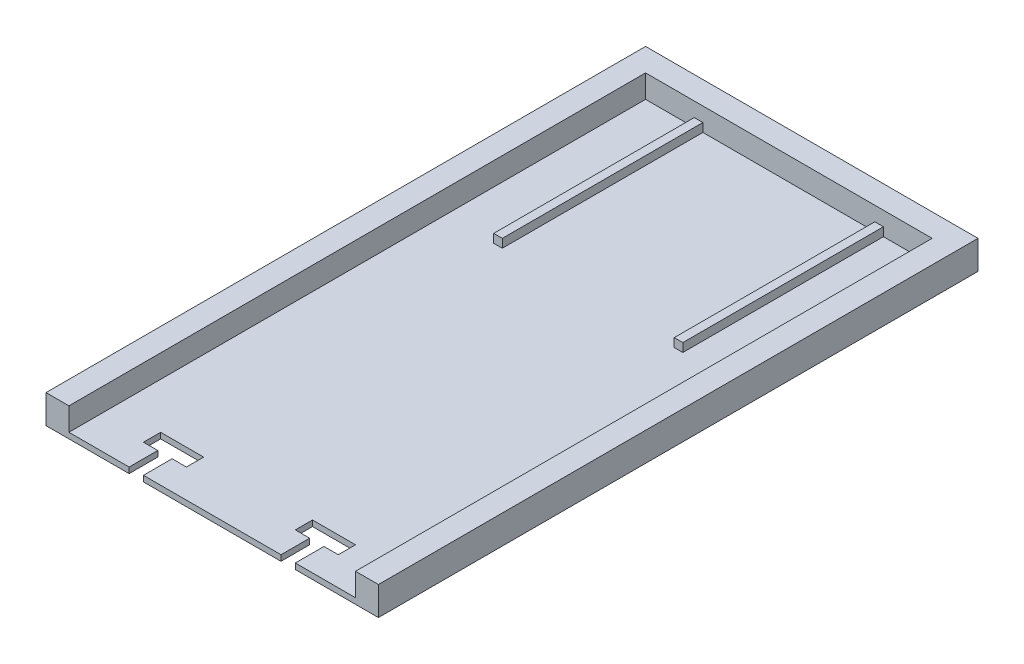
ISO-10303-21;
HEADER;
FILE_DESCRIPTION(('STEP AP214'),'2;1');
FILE_NAME('part.step','',(''),(''),'','','');
FILE_SCHEMA(('AUTOMOTIVE_DESIGN { 1 0 10303 214 1 1 1 1 }'));
ENDSEC;
DATA;
#1=APPLICATION_CONTEXT('core data for automotive mechanical design processes');
#2=APPLICATION_PROTOCOL_DEFINITION('international standard','automotive_design',2000,#1);
#3=PRODUCT_CONTEXT('',#1,'mechanical');
#4=PRODUCT('Part','Part','',(#3));
#5=PRODUCT_RELATED_PRODUCT_CATEGORY('part','',(#4));
#6=PRODUCT_DEFINITION_FORMATION('','',#4);
#7=PRODUCT_DEFINITION_CONTEXT('part definition',#1,'design');
#8=PRODUCT_DEFINITION('design','',#6,#7);
#9=PRODUCT_DEFINITION_SHAPE('','',#8);
#10=(LENGTH_UNIT() NAMED_UNIT(*) SI_UNIT(.MILLI.,.METRE.));
#11=(NAMED_UNIT(*) PLANE_ANGLE_UNIT() SI_UNIT($,.RADIAN.));
#12=(NAMED_UNIT(*) SI_UNIT($,.STERADIAN.) SOLID_ANGLE_UNIT());
#13=UNCERTAINTY_MEASURE_WITH_UNIT(LENGTH_MEASURE(1.E-05),#10,'distance_accuracy_value','');
#14=(GEOMETRIC_REPRESENTATION_CONTEXT(3) GLOBAL_UNCERTAINTY_ASSIGNED_CONTEXT((#13)) GLOBAL_UNIT_ASSIGNED_CONTEXT((#10,
#11,#12)) REPRESENTATION_CONTEXT('',''));
#15=CARTESIAN_POINT('',(0.,0.,0.));
#16=DIRECTION('',(0.,0.,1.));
#17=DIRECTION('',(1.,0.,0.));
#18=AXIS2_PLACEMENT_3D('',#15,#16,#17);
#19=CARTESIAN_POINT('',(-1128.10486715688,14.,-699.26737968449));
#20=DIRECTION('',(0.,0.,1.));
#21=DIRECTION('',(1.,0.,0.));
#22=AXIS2_PLACEMENT_3D('',#19,#20,#21);
#23=PLANE('',#22);
#24=DIRECTION('',(0.,-1.,0.));
#25=VECTOR('',#24,1.);
#26=CARTESIAN_POINT('',(-1131.10486715688,14.,-699.26737968449));
#27=LINE('',#26,#25);
#28=CARTESIAN_POINT('',(-1131.10486715688,5.,-699.26737968449));
#29=VERTEX_POINT('',#28);
#30=CARTESIAN_POINT('',(-1131.10486715688,2.,-699.26737968449));
#31=VERTEX_POINT('',#30);
#32=EDGE_CURVE('E257',#29,#31,#27,.T.);
#33=ORIENTED_EDGE('',*,*,#32,.T.);
#34=DIRECTION('',(-1.,0.,0.));
#35=VECTOR('',#34,1.);
#36=CARTESIAN_POINT('',(-1131.10486715688,2.,-699.26737968449));
#37=LINE('',#36,#35);
#38=CARTESIAN_POINT('',(-1128.10486715688,2.,-699.26737968449));
#39=VERTEX_POINT('',#38);
#40=EDGE_CURVE('E249',#39,#31,#37,.T.);
#41=ORIENTED_EDGE('',*,*,#40,.F.);
#42=DIRECTION('',(0.,-1.,0.));
#43=VECTOR('',#42,1.);
#44=CARTESIAN_POINT('',(-1128.10486715688,14.,-699.26737968449));
#45=LINE('',#44,#43);
#46=CARTESIAN_POINT('',(-1128.10486715688,5.,-699.26737968449));
#47=VERTEX_POINT('',#46);
#48=EDGE_CURVE('E55',#47,#39,#45,.T.);
#49=ORIENTED_EDGE('',*,*,#48,.F.);
#50=DIRECTION('',(-1.,0.,0.));
#51=VECTOR('',#50,1.);
#52=CARTESIAN_POINT('',(0.,5.,-699.26737968449));
#53=LINE('',#52,#51);
#54=EDGE_CURVE('E11',#47,#29,#53,.T.);
#55=ORIENTED_EDGE('',*,*,#54,.T.);
#56=EDGE_LOOP('',(#33,#41,#49,#55));
#57=FACE_BOUND('',#56,.T.);
#58=ADVANCED_FACE('F41',(#57),#23,.T.);
#59=CARTESIAN_POINT('',(0.,0.,0.));
#60=DIRECTION('',(0.,-1.,0.));
#61=DIRECTION('',(0.,0.,-1.));
#62=AXIS2_PLACEMENT_3D('',#59,#60,#61);
#63=PLANE('',#62);
#64=DIRECTION('',(0.,0.,-1.));
#65=VECTOR('',#64,1.);
#66=CARTESIAN_POINT('',(-1040.10486715688,0.,-777.26737968449));
#67=LINE('',#66,#65);
#68=CARTESIAN_POINT('',(-1040.10486715688,0.,-568.047695244119));
#69=VERTEX_POINT('',#68);
#70=CARTESIAN_POINT('',(-1040.10486715688,0.,-777.26737968449));
#71=VERTEX_POINT('',#70);
#72=EDGE_CURVE('E315',#69,#71,#67,.T.);
#73=ORIENTED_EDGE('',*,*,#72,.F.);
#74=DIRECTION('',(-1.,0.,0.));
#75=VECTOR('',#74,1.);
#76=CARTESIAN_POINT('',(0.,0.,-568.047695244119));
#77=LINE('',#76,#75);
#78=CARTESIAN_POINT('',(-1069.10486715688,0.,-568.047695244119));
#79=VERTEX_POINT('',#78);
#80=EDGE_CURVE('E449',#69,#79,#77,.T.);
#81=ORIENTED_EDGE('',*,*,#80,.T.);
#82=DIRECTION('',(0.,0.,1.));
#83=VECTOR('',#82,1.);
#84=CARTESIAN_POINT('',(-1069.10486715688,0.,0.));
#85=LINE('',#84,#83);
#86=CARTESIAN_POINT('',(-1069.10486715688,0.,-578.047695244119));
#87=VERTEX_POINT('',#86);
#88=EDGE_CURVE('E363',#87,#79,#85,.T.);
#89=ORIENTED_EDGE('',*,*,#88,.F.);
#90=DIRECTION('',(-1.,0.,0.));
#91=VECTOR('',#90,1.);
#92=CARTESIAN_POINT('',(0.,0.,-578.047695244119));
#93=LINE('',#92,#91);
#94=CARTESIAN_POINT('',(-1064.10486715688,0.,-578.047695244119));
#95=VERTEX_POINT('',#94);
#96=EDGE_CURVE('E361',#95,#87,#93,.T.);
#97=ORIENTED_EDGE('',*,*,#96,.F.);
#98=DIRECTION('',(0.,0.,1.));
#99=VECTOR('',#98,1.);
#100=CARTESIAN_POINT('',(-1064.10486715688,0.,0.));
#101=LINE('',#100,#99);
#102=CARTESIAN_POINT('',(-1064.10486715688,0.,-584.047695244119));
#103=VERTEX_POINT('',#102);
#104=EDGE_CURVE('E359',#103,#95,#101,.T.);
#105=ORIENTED_EDGE('',*,*,#104,.F.);
#106=DIRECTION('',(-1.,0.,0.));
#107=VECTOR('',#106,1.);
#108=CARTESIAN_POINT('',(0.,0.,-584.047695244119));
#109=LINE('',#108,#107);
#110=CARTESIAN_POINT('',(-1079.10486715688,0.,-584.047695244119));
#111=VERTEX_POINT('',#110);
#112=EDGE_CURVE('E356',#103,#111,#109,.T.);
#113=ORIENTED_EDGE('',*,*,#112,.T.);
#114=DIRECTION('',(0.,0.,1.));
#115=VECTOR('',#114,1.);
#116=CARTESIAN_POINT('',(-1079.10486715688,0.,0.));
#117=LINE('',#116,#115);
#118=CARTESIAN_POINT('',(-1079.10486715688,0.,-578.047695244119));
#119=VERTEX_POINT('',#118);
#120=EDGE_CURVE('E353',#111,#119,#117,.T.);
#121=ORIENTED_EDGE('',*,*,#120,.T.);
#122=DIRECTION('',(1.,0.,0.));
#123=VECTOR('',#122,1.);
#124=CARTESIAN_POINT('',(0.,0.,-578.047695244119));
#125=LINE('',#124,#123);
#126=CARTESIAN_POINT('',(-1074.10486715688,0.,-578.047695244119));
#127=VERTEX_POINT('',#126);
#128=EDGE_CURVE('E350',#119,#127,#125,.T.);
#129=ORIENTED_EDGE('',*,*,#128,.T.);
#130=DIRECTION('',(0.,0.,1.));
#131=VECTOR('',#130,1.);
#132=CARTESIAN_POINT('',(-1074.10486715688,0.,0.));
#133=LINE('',#132,#131);
#134=CARTESIAN_POINT('',(-1074.10486715688,0.,-568.047695244119));
#135=VERTEX_POINT('',#134);
#136=EDGE_CURVE('E347',#127,#135,#133,.T.);
#137=ORIENTED_EDGE('',*,*,#136,.T.);
#138=DIRECTION('',(-1.,0.,0.));
#139=VECTOR('',#138,1.);
#140=CARTESIAN_POINT('',(0.,0.,-568.047695244119));
#141=LINE('',#140,#139);
#142=CARTESIAN_POINT('',(-1122.10486715688,0.,-568.047695244119));
#143=VERTEX_POINT('',#142);
#144=EDGE_CURVE('E344',#135,#143,#141,.T.);
#145=ORIENTED_EDGE('',*,*,#144,.T.);
#146=DIRECTION('',(0.,0.,1.));
#147=VECTOR('',#146,1.);
#148=CARTESIAN_POINT('',(-1122.10486715688,0.,0.));
#149=LINE('',#148,#147);
#150=CARTESIAN_POINT('',(-1122.10486715688,0.,-578.047695244119));
#151=VERTEX_POINT('',#150);
#152=EDGE_CURVE('E342',#151,#143,#149,.T.);
#153=ORIENTED_EDGE('',*,*,#152,.F.);
#154=DIRECTION('',(-1.,0.,0.));
#155=VECTOR('',#154,1.);
#156=CARTESIAN_POINT('',(0.,0.,-578.047695244119));
#157=LINE('',#156,#155);
#158=CARTESIAN_POINT('',(-1117.10486715688,0.,-578.047695244119));
#159=VERTEX_POINT('',#158);
#160=EDGE_CURVE('E340',#159,#151,#157,.T.);
#161=ORIENTED_EDGE('',*,*,#160,.F.);
#162=DIRECTION('',(0.,0.,1.));
#163=VECTOR('',#162,1.);
#164=CARTESIAN_POINT('',(-1117.10486715688,0.,0.));
#165=LINE('',#164,#163);
#166=CARTESIAN_POINT('',(-1117.10486715688,0.,-584.047695244119));
#167=VERTEX_POINT('',#166);
#168=EDGE_CURVE('E338',#167,#159,#165,.T.);
#169=ORIENTED_EDGE('',*,*,#168,.F.);
#170=DIRECTION('',(1.,0.,0.));
#171=VECTOR('',#170,1.);
#172=CARTESIAN_POINT('',(0.,0.,-584.047695244119));
#173=LINE('',#172,#171);
#174=CARTESIAN_POINT('',(-1132.10486715688,0.,-584.047695244119));
#175=VERTEX_POINT('',#174);
#176=EDGE_CURVE('E336',#175,#167,#173,.T.);
#177=ORIENTED_EDGE('',*,*,#176,.F.);
#178=DIRECTION('',(0.,0.,1.));
#179=VECTOR('',#178,1.);
#180=CARTESIAN_POINT('',(-1132.10486715688,0.,0.));
#181=LINE('',#180,#179);
#182=CARTESIAN_POINT('',(-1132.10486715688,0.,-578.047695244119));
#183=VERTEX_POINT('',#182);
#184=EDGE_CURVE('E333',#175,#183,#181,.T.);
#185=ORIENTED_EDGE('',*,*,#184,.T.);
#186=DIRECTION('',(1.,0.,0.));
#187=VECTOR('',#186,1.);
#188=CARTESIAN_POINT('',(0.,0.,-578.047695244119));
#189=LINE('',#188,#187);
#190=CARTESIAN_POINT('',(-1127.10486715688,0.,-578.047695244119));
#191=VERTEX_POINT('',#190);
#192=EDGE_CURVE('E330',#183,#191,#189,.T.);
#193=ORIENTED_EDGE('',*,*,#192,.T.);
#194=DIRECTION('',(0.,0.,1.));
#195=VECTOR('',#194,1.);
#196=CARTESIAN_POINT('',(-1127.10486715688,0.,0.));
#197=LINE('',#196,#195);
#198=CARTESIAN_POINT('',(-1127.10486715688,0.,-568.047695244119));
#199=VERTEX_POINT('',#198);
#200=EDGE_CURVE('E327',#191,#199,#197,.T.);
#201=ORIENTED_EDGE('',*,*,#200,.T.);
#202=DIRECTION('',(-1.,0.,0.));
#203=VECTOR('',#202,1.);
#204=CARTESIAN_POINT('',(0.,0.,-568.047695244119));
#205=LINE('',#204,#203);
#206=CARTESIAN_POINT('',(-1156.10486715688,0.,-568.047695244119));
#207=VERTEX_POINT('',#206);
#208=EDGE_CURVE('E454',#199,#207,#205,.T.);
#209=ORIENTED_EDGE('',*,*,#208,.T.);
#210=DIRECTION('',(0.,0.,1.));
#211=VECTOR('',#210,1.);
#212=CARTESIAN_POINT('',(-1156.10486715688,0.,-361.26737968449));
#213=LINE('',#212,#211);
#214=CARTESIAN_POINT('',(-1156.10486715688,0.,-777.26737968449));
#215=VERTEX_POINT('',#214);
#216=EDGE_CURVE('E301',#215,#207,#213,.T.);
#217=ORIENTED_EDGE('',*,*,#216,.F.);
#218=DIRECTION('',(-1.,0.,0.));
#219=VECTOR('',#218,1.);
#220=CARTESIAN_POINT('',(-1156.10486715688,0.,-777.26737968449));
#221=LINE('',#220,#219);
#222=EDGE_CURVE('E308',#71,#215,#221,.T.);
#223=ORIENTED_EDGE('',*,*,#222,.F.);
#224=EDGE_LOOP('',(#73,#81,#89,#97,#105,#113,#121,#129,#137,#145,#153,#161,#169,#177,#185,#193,
#201,#209,#217,#223));
#225=FACE_BOUND('',#224,.T.);
#226=ADVANCED_FACE('F535',(#225),#63,.T.);
#227=CARTESIAN_POINT('',(-1131.10486715688,5.,-669.26737968449));
#228=DIRECTION('',(1.,0.,0.));
#229=DIRECTION('',(0.,0.,-1.));
#230=AXIS2_PLACEMENT_3D('',#227,#228,#229);
#231=PLANE('',#230);
#232=ORIENTED_EDGE('',*,*,#32,.F.);
#233=DIRECTION('',(0.,0.,1.));
#234=VECTOR('',#233,1.);
#235=CARTESIAN_POINT('',(-1131.10486715688,5.,-669.26737968449));
#236=LINE('',#235,#234);
#237=CARTESIAN_POINT('',(-1131.10486715688,5.,-769.26737968449));
#238=VERTEX_POINT('',#237);
#239=EDGE_CURVE('E392',#238,#29,#236,.T.);
#240=ORIENTED_EDGE('',*,*,#239,.F.);
#241=DIRECTION('',(0.,-1.,0.));
#242=VECTOR('',#241,1.);
#243=CARTESIAN_POINT('',(-1131.10486715688,5.,-769.26737968449));
#244=LINE('',#243,#242);
#245=CARTESIAN_POINT('',(-1131.10486715688,2.,-769.26737968449));
#246=VERTEX_POINT('',#245);
#247=EDGE_CURVE('E265',#238,#246,#244,.T.);
#248=ORIENTED_EDGE('',*,*,#247,.T.);
#249=DIRECTION('',(0.,0.,1.));
#250=VECTOR('',#249,1.);
#251=CARTESIAN_POINT('',(-1131.10486715688,2.,-669.26737968449));
#252=LINE('',#251,#250);
#253=EDGE_CURVE('E253',#246,#31,#252,.T.);
#254=ORIENTED_EDGE('',*,*,#253,.T.);
#255=EDGE_LOOP('',(#232,#240,#248,#254));
#256=FACE_BOUND('',#255,.T.);
#257=ADVANCED_FACE('F263',(#256),#231,.F.);
#258=CARTESIAN_POINT('',(-1128.10486715688,5.,-769.26737968449));
#259=DIRECTION('',(-1.,0.,0.));
#260=DIRECTION('',(0.,0.,1.));
#261=AXIS2_PLACEMENT_3D('',#258,#259,#260);
#262=PLANE('',#261);
#263=ORIENTED_EDGE('',*,*,#48,.T.);
#264=DIRECTION('',(0.,0.,-1.));
#265=VECTOR('',#264,1.);
#266=CARTESIAN_POINT('',(-1128.10486715688,2.,-769.26737968449));
#267=LINE('',#266,#265);
#268=CARTESIAN_POINT('',(-1128.10486715688,2.,-769.26737968449));
#269=VERTEX_POINT('',#268);
#270=EDGE_CURVE('E256',#39,#269,#267,.T.);
#271=ORIENTED_EDGE('',*,*,#270,.T.);
#272=DIRECTION('',(0.,-1.,0.));
#273=VECTOR('',#272,1.);
#274=CARTESIAN_POINT('',(-1128.10486715688,5.,-769.26737968449));
#275=LINE('',#274,#273);
#276=CARTESIAN_POINT('',(-1128.10486715688,5.,-769.26737968449));
#277=VERTEX_POINT('',#276);
#278=EDGE_CURVE('E276',#277,#269,#275,.T.);
#279=ORIENTED_EDGE('',*,*,#278,.F.);
#280=DIRECTION('',(0.,0.,-1.));
#281=VECTOR('',#280,1.);
#282=CARTESIAN_POINT('',(-1128.10486715688,5.,-769.26737968449));
#283=LINE('',#282,#281);
#284=EDGE_CURVE('E273',#47,#277,#283,.T.);
#285=ORIENTED_EDGE('',*,*,#284,.F.);
#286=EDGE_LOOP('',(#263,#271,#279,#285));
#287=FACE_BOUND('',#286,.T.);
#288=ADVANCED_FACE('F399',(#287),#262,.F.);
#289=CARTESIAN_POINT('',(0.,5.,0.));
#290=DIRECTION('',(0.,-1.,0.));
#291=DIRECTION('',(0.,0.,-1.));
#292=AXIS2_PLACEMENT_3D('',#289,#290,#291);
#293=PLANE('',#292);
#294=ORIENTED_EDGE('',*,*,#54,.F.);
#295=ORIENTED_EDGE('',*,*,#284,.T.);
#296=DIRECTION('',(-1.,0.,0.));
#297=VECTOR('',#296,1.);
#298=CARTESIAN_POINT('',(-1128.10486715688,5.,-769.26737968449));
#299=LINE('',#298,#297);
#300=EDGE_CURVE('E268',#277,#238,#299,.T.);
#301=ORIENTED_EDGE('',*,*,#300,.T.);
#302=ORIENTED_EDGE('',*,*,#239,.T.);
#303=EDGE_LOOP('',(#294,#295,#301,#302));
#304=FACE_BOUND('',#303,.T.);
#305=ADVANCED_FACE('F396',(#304),#293,.F.);
#306=CARTESIAN_POINT('',(-1068.10486715688,5.,-769.26737968449));
#307=DIRECTION('',(1.,0.,0.));
#308=DIRECTION('',(0.,0.,-1.));
#309=AXIS2_PLACEMENT_3D('',#306,#307,#308);
#310=PLANE('',#309);
#311=DIRECTION('',(0.,-1.,0.));
#312=VECTOR('',#311,1.);
#313=CARTESIAN_POINT('',(-1068.10486715688,12.,-699.26737968449));
#314=LINE('',#313,#312);
#315=CARTESIAN_POINT('',(-1068.10486715688,5.,-699.26737968449));
#316=VERTEX_POINT('',#315);
#317=CARTESIAN_POINT('',(-1068.10486715688,2.,-699.26737968449));
#318=VERTEX_POINT('',#317);
#319=EDGE_CURVE('E410',#316,#318,#314,.T.);
#320=ORIENTED_EDGE('',*,*,#319,.F.);
#321=DIRECTION('',(0.,0.,1.));
#322=VECTOR('',#321,1.);
#323=CARTESIAN_POINT('',(-1068.10486715688,5.,-769.26737968449));
#324=LINE('',#323,#322);
#325=CARTESIAN_POINT('',(-1068.10486715688,5.,-769.26737968449));
#326=VERTEX_POINT('',#325);
#327=EDGE_CURVE('E372',#326,#316,#324,.T.);
#328=ORIENTED_EDGE('',*,*,#327,.F.);
#329=DIRECTION('',(0.,-1.,0.));
#330=VECTOR('',#329,1.);
#331=CARTESIAN_POINT('',(-1068.10486715688,5.,-769.26737968449));
#332=LINE('',#331,#330);
#333=CARTESIAN_POINT('',(-1068.10486715688,2.,-769.26737968449));
#334=VERTEX_POINT('',#333);
#335=EDGE_CURVE('E266',#326,#334,#332,.T.);
#336=ORIENTED_EDGE('',*,*,#335,.T.);
#337=DIRECTION('',(0.,0.,1.));
#338=VECTOR('',#337,1.);
#339=CARTESIAN_POINT('',(-1068.10486715688,2.,-769.26737968449));
#340=LINE('',#339,#338);
#341=EDGE_CURVE('E385',#334,#318,#340,.T.);
#342=ORIENTED_EDGE('',*,*,#341,.T.);
#343=EDGE_LOOP('',(#320,#328,#336,#342));
#344=FACE_BOUND('',#343,.T.);
#345=ADVANCED_FACE('F409',(#344),#310,.F.);
#346=CARTESIAN_POINT('',(-1065.10486715688,5.,-669.26737968449));
#347=DIRECTION('',(-1.,0.,0.));
#348=DIRECTION('',(0.,0.,1.));
#349=AXIS2_PLACEMENT_3D('',#346,#347,#348);
#350=PLANE('',#349);
#351=DIRECTION('',(0.,-1.,0.));
#352=VECTOR('',#351,1.);
#353=CARTESIAN_POINT('',(-1065.10486715688,12.,-699.26737968449));
#354=LINE('',#353,#352);
#355=CARTESIAN_POINT('',(-1065.10486715688,5.,-699.26737968449));
#356=VERTEX_POINT('',#355);
#357=CARTESIAN_POINT('',(-1065.10486715688,2.,-699.26737968449));
#358=VERTEX_POINT('',#357);
#359=EDGE_CURVE('E63',#356,#358,#354,.T.);
#360=ORIENTED_EDGE('',*,*,#359,.T.);
#361=DIRECTION('',(0.,0.,-1.));
#362=VECTOR('',#361,1.);
#363=CARTESIAN_POINT('',(-1065.10486715688,2.,-669.26737968449));
#364=LINE('',#363,#362);
#365=CARTESIAN_POINT('',(-1065.10486715688,2.,-769.26737968449));
#366=VERTEX_POINT('',#365);
#367=EDGE_CURVE('E388',#358,#366,#364,.T.);
#368=ORIENTED_EDGE('',*,*,#367,.T.);
#369=DIRECTION('',(0.,-1.,0.));
#370=VECTOR('',#369,1.);
#371=CARTESIAN_POINT('',(-1065.10486715688,5.,-769.26737968449));
#372=LINE('',#371,#370);
#373=CARTESIAN_POINT('',(-1065.10486715688,5.,-769.26737968449));
#374=VERTEX_POINT('',#373);
#375=EDGE_CURVE('E270',#374,#366,#372,.T.);
#376=ORIENTED_EDGE('',*,*,#375,.F.);
#377=DIRECTION('',(0.,0.,-1.));
#378=VECTOR('',#377,1.);
#379=CARTESIAN_POINT('',(-1065.10486715688,5.,-669.26737968449));
#380=LINE('',#379,#378);
#381=EDGE_CURVE('E370',#356,#374,#380,.T.);
#382=ORIENTED_EDGE('',*,*,#381,.F.);
#383=EDGE_LOOP('',(#360,#368,#376,#382));
#384=FACE_BOUND('',#383,.T.);
#385=ADVANCED_FACE('F375',(#384),#350,.F.);
#386=CARTESIAN_POINT('',(0.,5.,0.));
#387=DIRECTION('',(0.,1.,0.));
#388=DIRECTION('',(0.,0.,1.));
#389=AXIS2_PLACEMENT_3D('',#386,#387,#388);
#390=PLANE('',#389);
#391=ORIENTED_EDGE('',*,*,#327,.T.);
#392=DIRECTION('',(1.,0.,0.));
#393=VECTOR('',#392,1.);
#394=CARTESIAN_POINT('',(0.,5.,-699.26737968449));
#395=LINE('',#394,#393);
#396=EDGE_CURVE('E49',#316,#356,#395,.T.);
#397=ORIENTED_EDGE('',*,*,#396,.T.);
#398=ORIENTED_EDGE('',*,*,#381,.T.);
#399=DIRECTION('',(-1.,0.,0.));
#400=VECTOR('',#399,1.);
#401=CARTESIAN_POINT('',(-1068.10486715688,5.,-769.26737968449));
#402=LINE('',#401,#400);
#403=EDGE_CURVE('E381',#374,#326,#402,.T.);
#404=ORIENTED_EDGE('',*,*,#403,.T.);
#405=EDGE_LOOP('',(#391,#397,#398,#404));
#406=FACE_BOUND('',#405,.T.);
#407=ADVANCED_FACE('F368',(#406),#390,.T.);
#408=CARTESIAN_POINT('',(-1156.10486715688,10.,-361.26737968449));
#409=DIRECTION('',(1.,0.,0.));
#410=DIRECTION('',(0.,0.,-1.));
#411=AXIS2_PLACEMENT_3D('',#408,#409,#410);
#412=PLANE('',#411);
#413=DIRECTION('',(0.,1.,0.));
#414=VECTOR('',#413,1.);
#415=CARTESIAN_POINT('',(-1156.10486715688,-5.,-568.047695244119));
#416=LINE('',#415,#414);
#417=CARTESIAN_POINT('',(-1156.10486715688,10.,-568.047695244119));
#418=VERTEX_POINT('',#417);
#419=EDGE_CURVE('E463',#207,#418,#416,.T.);
#420=ORIENTED_EDGE('',*,*,#419,.T.);
#421=DIRECTION('',(0.,0.,1.));
#422=VECTOR('',#421,1.);
#423=CARTESIAN_POINT('',(-1156.10486715688,10.,-361.26737968449));
#424=LINE('',#423,#422);
#425=CARTESIAN_POINT('',(-1156.10486715688,10.,-777.26737968449));
#426=VERTEX_POINT('',#425);
#427=EDGE_CURVE('E304',#426,#418,#424,.T.);
#428=ORIENTED_EDGE('',*,*,#427,.F.);
#429=DIRECTION('',(0.,-1.,0.));
#430=VECTOR('',#429,1.);
#431=CARTESIAN_POINT('',(-1156.10486715688,10.,-777.26737968449));
#432=LINE('',#431,#430);
#433=EDGE_CURVE('E312',#426,#215,#432,.T.);
#434=ORIENTED_EDGE('',*,*,#433,.T.);
#435=ORIENTED_EDGE('',*,*,#216,.T.);
#436=EDGE_LOOP('',(#420,#428,#434,#435));
#437=FACE_BOUND('',#436,.T.);
#438=ADVANCED_FACE('F43',(#437),#412,.F.);
#439=CARTESIAN_POINT('',(-1148.10486715688,2.,-769.26737968449));
#440=DIRECTION('',(-1.,0.,0.));
#441=DIRECTION('',(0.,0.,1.));
#442=AXIS2_PLACEMENT_3D('',#439,#440,#441);
#443=PLANE('',#442);
#444=DIRECTION('',(0.,0.,1.));
#445=VECTOR('',#444,1.);
#446=CARTESIAN_POINT('',(-1148.10486715688,10.,-769.26737968449));
#447=LINE('',#446,#445);
#448=CARTESIAN_POINT('',(-1148.10486715688,10.,-769.26737968449));
#449=VERTEX_POINT('',#448);
#450=CARTESIAN_POINT('',(-1148.10486715688,10.,-568.047695244119));
#451=VERTEX_POINT('',#450);
#452=EDGE_CURVE('E284',#449,#451,#447,.T.);
#453=ORIENTED_EDGE('',*,*,#452,.T.);
#454=DIRECTION('',(0.,1.,0.));
#455=VECTOR('',#454,1.);
#456=CARTESIAN_POINT('',(-1148.10486715688,2.,-568.047695244119));
#457=LINE('',#456,#455);
#458=CARTESIAN_POINT('',(-1148.10486715688,2.,-568.047695244119));
#459=VERTEX_POINT('',#458);
#460=EDGE_CURVE('E323',#459,#451,#457,.T.);
#461=ORIENTED_EDGE('',*,*,#460,.F.);
#462=DIRECTION('',(0.,0.,1.));
#463=VECTOR('',#462,1.);
#464=CARTESIAN_POINT('',(-1148.10486715688,2.,-769.26737968449));
#465=LINE('',#464,#463);
#466=CARTESIAN_POINT('',(-1148.10486715688,2.,-769.26737968449));
#467=VERTEX_POINT('',#466);
#468=EDGE_CURVE('E288',#467,#459,#465,.T.);
#469=ORIENTED_EDGE('',*,*,#468,.F.);
#470=DIRECTION('',(0.,1.,0.));
#471=VECTOR('',#470,1.);
#472=CARTESIAN_POINT('',(-1148.10486715688,2.,-769.26737968449));
#473=LINE('',#472,#471);
#474=EDGE_CURVE('E299',#467,#449,#473,.T.);
#475=ORIENTED_EDGE('',*,*,#474,.T.);
#476=EDGE_LOOP('',(#453,#461,#469,#475));
#477=FACE_BOUND('',#476,.T.);
#478=ADVANCED_FACE('F641',(#477),#443,.F.);
#479=CARTESIAN_POINT('',(0.,10.,0.));
#480=DIRECTION('',(0.,-1.,0.));
#481=DIRECTION('',(0.,0.,-1.));
#482=AXIS2_PLACEMENT_3D('',#479,#480,#481);
#483=PLANE('',#482);
#484=DIRECTION('',(-1.,0.,0.));
#485=VECTOR('',#484,1.);
#486=CARTESIAN_POINT('',(-1148.10486715688,10.,-568.047695244119));
#487=LINE('',#486,#485);
#488=EDGE_CURVE('E464',#451,#418,#487,.T.);
#489=ORIENTED_EDGE('',*,*,#488,.F.);
#490=ORIENTED_EDGE('',*,*,#452,.F.);
#491=DIRECTION('',(-1.,0.,0.));
#492=VECTOR('',#491,1.);
#493=CARTESIAN_POINT('',(-1148.10486715688,10.,-769.26737968449));
#494=LINE('',#493,#492);
#495=CARTESIAN_POINT('',(-1048.10486715688,10.,-769.26737968449));
#496=VERTEX_POINT('',#495);
#497=EDGE_CURVE('E294',#496,#449,#494,.T.);
#498=ORIENTED_EDGE('',*,*,#497,.F.);
#499=DIRECTION('',(0.,0.,-1.));
#500=VECTOR('',#499,1.);
#501=CARTESIAN_POINT('',(-1048.10486715688,10.,-769.26737968449));
#502=LINE('',#501,#500);
#503=CARTESIAN_POINT('',(-1048.10486715688,10.,-568.047695244119));
#504=VERTEX_POINT('',#503);
#505=EDGE_CURVE('E280',#504,#496,#502,.T.);
#506=ORIENTED_EDGE('',*,*,#505,.F.);
#507=DIRECTION('',(1.,0.,0.));
#508=VECTOR('',#507,1.);
#509=CARTESIAN_POINT('',(-1048.10486715688,10.,-568.047695244119));
#510=LINE('',#509,#508);
#511=CARTESIAN_POINT('',(-1040.10486715688,10.,-568.047695244119));
#512=VERTEX_POINT('',#511);
#513=EDGE_CURVE('E512',#504,#512,#510,.T.);
#514=ORIENTED_EDGE('',*,*,#513,.T.);
#515=DIRECTION('',(0.,0.,-1.));
#516=VECTOR('',#515,1.);
#517=CARTESIAN_POINT('',(-1040.10486715688,10.,-777.26737968449));
#518=LINE('',#517,#516);
#519=CARTESIAN_POINT('',(-1040.10486715688,10.,-777.26737968449));
#520=VERTEX_POINT('',#519);
#521=EDGE_CURVE('E307',#512,#520,#518,.T.);
#522=ORIENTED_EDGE('',*,*,#521,.T.);
#523=DIRECTION('',(-1.,0.,0.));
#524=VECTOR('',#523,1.);
#525=CARTESIAN_POINT('',(-1156.10486715688,10.,-777.26737968449));
#526=LINE('',#525,#524);
#527=EDGE_CURVE('E310',#520,#426,#526,.T.);
#528=ORIENTED_EDGE('',*,*,#527,.T.);
#529=ORIENTED_EDGE('',*,*,#427,.T.);
#530=EDGE_LOOP('',(#489,#490,#498,#506,#514,#522,#528,#529));
#531=FACE_BOUND('',#530,.T.);
#532=ADVANCED_FACE('F548',(#531),#483,.F.);
#533=CARTESIAN_POINT('',(0.,2.,0.));
#534=DIRECTION('',(0.,1.,0.));
#535=DIRECTION('',(0.,0.,1.));
#536=AXIS2_PLACEMENT_3D('',#533,#534,#535);
#537=PLANE('',#536);
#538=ORIENTED_EDGE('',*,*,#40,.T.);
#539=ORIENTED_EDGE('',*,*,#253,.F.);
#540=DIRECTION('',(-1.,0.,0.));
#541=VECTOR('',#540,1.);
#542=CARTESIAN_POINT('',(-1148.10486715688,2.,-769.26737968449));
#543=LINE('',#542,#541);
#544=EDGE_CURVE('E283',#246,#467,#543,.T.);
#545=ORIENTED_EDGE('',*,*,#544,.T.);
#546=ORIENTED_EDGE('',*,*,#468,.T.);
#547=DIRECTION('',(1.,0.,0.));
#548=VECTOR('',#547,1.);
#549=CARTESIAN_POINT('',(0.,2.,-568.047695244119));
#550=LINE('',#549,#548);
#551=CARTESIAN_POINT('',(-1127.10486715688,2.,-568.047695244119));
#552=VERTEX_POINT('',#551);
#553=EDGE_CURVE('E456',#459,#552,#550,.T.);
#554=ORIENTED_EDGE('',*,*,#553,.T.);
#555=DIRECTION('',(0.,0.,-1.));
#556=VECTOR('',#555,1.);
#557=CARTESIAN_POINT('',(-1127.10486715688,2.,0.));
#558=LINE('',#557,#556);
#559=CARTESIAN_POINT('',(-1127.10486715688,2.,-578.047695244119));
#560=VERTEX_POINT('',#559);
#561=EDGE_CURVE('E389',#552,#560,#558,.T.);
#562=ORIENTED_EDGE('',*,*,#561,.T.);
#563=DIRECTION('',(-1.,0.,0.));
#564=VECTOR('',#563,1.);
#565=CARTESIAN_POINT('',(0.,2.,-578.047695244119));
#566=LINE('',#565,#564);
#567=CARTESIAN_POINT('',(-1132.10486715688,2.,-578.047695244119));
#568=VERTEX_POINT('',#567);
#569=EDGE_CURVE('E414',#560,#568,#566,.T.);
#570=ORIENTED_EDGE('',*,*,#569,.T.);
#571=DIRECTION('',(0.,0.,-1.));
#572=VECTOR('',#571,1.);
#573=CARTESIAN_POINT('',(-1132.10486715688,2.,0.));
#574=LINE('',#573,#572);
#575=CARTESIAN_POINT('',(-1132.10486715688,2.,-584.047695244119));
#576=VERTEX_POINT('',#575);
#577=EDGE_CURVE('E417',#568,#576,#574,.T.);
#578=ORIENTED_EDGE('',*,*,#577,.T.);
#579=DIRECTION('',(-1.,0.,0.));
#580=VECTOR('',#579,1.);
#581=CARTESIAN_POINT('',(0.,2.,-584.047695244119));
#582=LINE('',#581,#580);
#583=CARTESIAN_POINT('',(-1117.10486715688,2.,-584.047695244119));
#584=VERTEX_POINT('',#583);
#585=EDGE_CURVE('E420',#584,#576,#582,.T.);
#586=ORIENTED_EDGE('',*,*,#585,.F.);
#587=DIRECTION('',(0.,0.,-1.));
#588=VECTOR('',#587,1.);
#589=CARTESIAN_POINT('',(-1117.10486715688,2.,0.));
#590=LINE('',#589,#588);
#591=CARTESIAN_POINT('',(-1117.10486715688,2.,-578.047695244119));
#592=VERTEX_POINT('',#591);
#593=EDGE_CURVE('E422',#592,#584,#590,.T.);
#594=ORIENTED_EDGE('',*,*,#593,.F.);
#595=DIRECTION('',(1.,0.,0.));
#596=VECTOR('',#595,1.);
#597=CARTESIAN_POINT('',(0.,2.,-578.047695244119));
#598=LINE('',#597,#596);
#599=CARTESIAN_POINT('',(-1122.10486715688,2.,-578.047695244119));
#600=VERTEX_POINT('',#599);
#601=EDGE_CURVE('E424',#600,#592,#598,.T.);
#602=ORIENTED_EDGE('',*,*,#601,.F.);
#603=DIRECTION('',(0.,0.,-1.));
#604=VECTOR('',#603,1.);
#605=CARTESIAN_POINT('',(-1122.10486715688,2.,0.));
#606=LINE('',#605,#604);
#607=CARTESIAN_POINT('',(-1122.10486715688,2.,-568.047695244119));
#608=VERTEX_POINT('',#607);
#609=EDGE_CURVE('E426',#608,#600,#606,.T.);
#610=ORIENTED_EDGE('',*,*,#609,.F.);
#611=DIRECTION('',(1.,0.,0.));
#612=VECTOR('',#611,1.);
#613=CARTESIAN_POINT('',(0.,2.,-568.047695244119));
#614=LINE('',#613,#612);
#615=CARTESIAN_POINT('',(-1074.10486715688,2.,-568.047695244119));
#616=VERTEX_POINT('',#615);
#617=EDGE_CURVE('E428',#608,#616,#614,.T.);
#618=ORIENTED_EDGE('',*,*,#617,.T.);
#619=DIRECTION('',(0.,0.,-1.));
#620=VECTOR('',#619,1.);
#621=CARTESIAN_POINT('',(-1074.10486715688,2.,0.));
#622=LINE('',#621,#620);
#623=CARTESIAN_POINT('',(-1074.10486715688,2.,-578.047695244119));
#624=VERTEX_POINT('',#623);
#625=EDGE_CURVE('E431',#616,#624,#622,.T.);
#626=ORIENTED_EDGE('',*,*,#625,.T.);
#627=DIRECTION('',(-1.,0.,0.));
#628=VECTOR('',#627,1.);
#629=CARTESIAN_POINT('',(0.,2.,-578.047695244119));
#630=LINE('',#629,#628);
#631=CARTESIAN_POINT('',(-1079.10486715688,2.,-578.047695244119));
#632=VERTEX_POINT('',#631);
#633=EDGE_CURVE('E434',#624,#632,#630,.T.);
#634=ORIENTED_EDGE('',*,*,#633,.T.);
#635=DIRECTION('',(0.,0.,-1.));
#636=VECTOR('',#635,1.);
#637=CARTESIAN_POINT('',(-1079.10486715688,2.,0.));
#638=LINE('',#637,#636);
#639=CARTESIAN_POINT('',(-1079.10486715688,2.,-584.047695244119));
#640=VERTEX_POINT('',#639);
#641=EDGE_CURVE('E437',#632,#640,#638,.T.);
#642=ORIENTED_EDGE('',*,*,#641,.T.);
#643=DIRECTION('',(1.,0.,0.));
#644=VECTOR('',#643,1.);
#645=CARTESIAN_POINT('',(0.,2.,-584.047695244119));
#646=LINE('',#645,#644);
#647=CARTESIAN_POINT('',(-1064.10486715688,2.,-584.047695244119));
#648=VERTEX_POINT('',#647);
#649=EDGE_CURVE('E440',#640,#648,#646,.T.);
#650=ORIENTED_EDGE('',*,*,#649,.T.);
#651=DIRECTION('',(0.,0.,-1.));
#652=VECTOR('',#651,1.);
#653=CARTESIAN_POINT('',(-1064.10486715688,2.,0.));
#654=LINE('',#653,#652);
#655=CARTESIAN_POINT('',(-1064.10486715688,2.,-578.047695244119));
#656=VERTEX_POINT('',#655);
#657=EDGE_CURVE('E443',#656,#648,#654,.T.);
#658=ORIENTED_EDGE('',*,*,#657,.F.);
#659=DIRECTION('',(1.,0.,0.));
#660=VECTOR('',#659,1.);
#661=CARTESIAN_POINT('',(0.,2.,-578.047695244119));
#662=LINE('',#661,#660);
#663=CARTESIAN_POINT('',(-1069.10486715688,2.,-578.047695244119));
#664=VERTEX_POINT('',#663);
#665=EDGE_CURVE('E445',#664,#656,#662,.T.);
#666=ORIENTED_EDGE('',*,*,#665,.F.);
#667=DIRECTION('',(0.,0.,-1.));
#668=VECTOR('',#667,1.);
#669=CARTESIAN_POINT('',(-1069.10486715688,2.,0.));
#670=LINE('',#669,#668);
#671=CARTESIAN_POINT('',(-1069.10486715688,2.,-568.047695244119));
#672=VERTEX_POINT('',#671);
#673=EDGE_CURVE('E447',#672,#664,#670,.T.);
#674=ORIENTED_EDGE('',*,*,#673,.F.);
#675=DIRECTION('',(1.,0.,0.));
#676=VECTOR('',#675,1.);
#677=CARTESIAN_POINT('',(0.,2.,-568.047695244119));
#678=LINE('',#677,#676);
#679=CARTESIAN_POINT('',(-1048.10486715688,2.,-568.047695244119));
#680=VERTEX_POINT('',#679);
#681=EDGE_CURVE('E451',#672,#680,#678,.T.);
#682=ORIENTED_EDGE('',*,*,#681,.T.);
#683=DIRECTION('',(0.,0.,-1.));
#684=VECTOR('',#683,1.);
#685=CARTESIAN_POINT('',(-1048.10486715688,2.,-769.26737968449));
#686=LINE('',#685,#684);
#687=CARTESIAN_POINT('',(-1048.10486715688,2.,-769.26737968449));
#688=VERTEX_POINT('',#687);
#689=EDGE_CURVE('E281',#680,#688,#686,.T.);
#690=ORIENTED_EDGE('',*,*,#689,.T.);
#691=EDGE_CURVE('E285',#688,#366,#543,.T.);
#692=ORIENTED_EDGE('',*,*,#691,.T.);
#693=ORIENTED_EDGE('',*,*,#367,.F.);
#694=DIRECTION('',(-1.,0.,0.));
#695=VECTOR('',#694,1.);
#696=CARTESIAN_POINT('',(-1068.10486715688,2.,-699.26737968449));
#697=LINE('',#696,#695);
#698=EDGE_CURVE('E519',#358,#318,#697,.T.);
#699=ORIENTED_EDGE('',*,*,#698,.T.);
#700=ORIENTED_EDGE('',*,*,#341,.F.);
#701=EDGE_CURVE('E289',#334,#269,#543,.T.);
#702=ORIENTED_EDGE('',*,*,#701,.T.);
#703=ORIENTED_EDGE('',*,*,#270,.F.);
#704=EDGE_LOOP('',(#538,#539,#545,#546,#554,#562,#570,#578,#586,#594,#602,#610,#618,#626,#634,
#642,#650,#658,#666,#674,#682,#690,#692,#693,#699,#700,#702,#703));
#705=FACE_BOUND('',#704,.T.);
#706=ADVANCED_FACE('F251',(#705),#537,.T.);
#707=CARTESIAN_POINT('',(-1040.10486715688,10.,-777.26737968449));
#708=DIRECTION('',(-1.,0.,0.));
#709=DIRECTION('',(0.,0.,1.));
#710=AXIS2_PLACEMENT_3D('',#707,#708,#709);
#711=PLANE('',#710);
#712=ORIENTED_EDGE('',*,*,#521,.F.);
#713=DIRECTION('',(0.,1.,0.));
#714=VECTOR('',#713,1.);
#715=CARTESIAN_POINT('',(-1040.10486715688,-5.,-568.047695244119));
#716=LINE('',#715,#714);
#717=EDGE_CURVE('E466',#69,#512,#716,.T.);
#718=ORIENTED_EDGE('',*,*,#717,.F.);
#719=ORIENTED_EDGE('',*,*,#72,.T.);
#720=DIRECTION('',(0.,-1.,0.));
#721=VECTOR('',#720,1.);
#722=CARTESIAN_POINT('',(-1040.10486715688,10.,-777.26737968449));
#723=LINE('',#722,#721);
#724=EDGE_CURVE('E320',#520,#71,#723,.T.);
#725=ORIENTED_EDGE('',*,*,#724,.F.);
#726=EDGE_LOOP('',(#712,#718,#719,#725));
#727=FACE_BOUND('',#726,.T.);
#728=ADVANCED_FACE('F554',(#727),#711,.F.);
#729=CARTESIAN_POINT('',(-1048.10486715688,2.,-769.26737968449));
#730=DIRECTION('',(1.,0.,0.));
#731=DIRECTION('',(0.,0.,-1.));
#732=AXIS2_PLACEMENT_3D('',#729,#730,#731);
#733=PLANE('',#732);
#734=DIRECTION('',(0.,-1.,0.));
#735=VECTOR('',#734,1.);
#736=CARTESIAN_POINT('',(-1048.10486715688,2.,-568.047695244119));
#737=LINE('',#736,#735);
#738=EDGE_CURVE('E325',#504,#680,#737,.T.);
#739=ORIENTED_EDGE('',*,*,#738,.F.);
#740=ORIENTED_EDGE('',*,*,#505,.T.);
#741=DIRECTION('',(0.,1.,0.));
#742=VECTOR('',#741,1.);
#743=CARTESIAN_POINT('',(-1048.10486715688,2.,-769.26737968449));
#744=LINE('',#743,#742);
#745=EDGE_CURVE('E292',#688,#496,#744,.T.);
#746=ORIENTED_EDGE('',*,*,#745,.F.);
#747=ORIENTED_EDGE('',*,*,#689,.F.);
#748=EDGE_LOOP('',(#739,#740,#746,#747));
#749=FACE_BOUND('',#748,.T.);
#750=ADVANCED_FACE('F556',(#749),#733,.F.);
#751=CARTESIAN_POINT('',(-1148.10486715688,2.,-769.26737968449));
#752=DIRECTION('',(0.,0.,-1.));
#753=DIRECTION('',(-1.,0.,0.));
#754=AXIS2_PLACEMENT_3D('',#751,#752,#753);
#755=PLANE('',#754);
#756=ORIENTED_EDGE('',*,*,#335,.F.);
#757=ORIENTED_EDGE('',*,*,#403,.F.);
#758=ORIENTED_EDGE('',*,*,#375,.T.);
#759=ORIENTED_EDGE('',*,*,#691,.F.);
#760=ORIENTED_EDGE('',*,*,#745,.T.);
#761=ORIENTED_EDGE('',*,*,#497,.T.);
#762=ORIENTED_EDGE('',*,*,#474,.F.);
#763=ORIENTED_EDGE('',*,*,#544,.F.);
#764=ORIENTED_EDGE('',*,*,#247,.F.);
#765=ORIENTED_EDGE('',*,*,#300,.F.);
#766=ORIENTED_EDGE('',*,*,#278,.T.);
#767=ORIENTED_EDGE('',*,*,#701,.F.);
#768=EDGE_LOOP('',(#756,#757,#758,#759,#760,#761,#762,#763,#764,#765,#766,#767));
#769=FACE_BOUND('',#768,.T.);
#770=ADVANCED_FACE('F403',(#769),#755,.F.);
#771=CARTESIAN_POINT('',(-1156.10486715688,10.,-777.26737968449));
#772=DIRECTION('',(0.,0.,1.));
#773=DIRECTION('',(1.,0.,0.));
#774=AXIS2_PLACEMENT_3D('',#771,#772,#773);
#775=PLANE('',#774);
#776=ORIENTED_EDGE('',*,*,#222,.T.);
#777=ORIENTED_EDGE('',*,*,#433,.F.);
#778=ORIENTED_EDGE('',*,*,#527,.F.);
#779=ORIENTED_EDGE('',*,*,#724,.T.);
#780=EDGE_LOOP('',(#776,#777,#778,#779));
#781=FACE_BOUND('',#780,.T.);
#782=ADVANCED_FACE('F550',(#781),#775,.F.);
#783=CARTESIAN_POINT('',(-1127.10486715688,-5.,0.));
#784=DIRECTION('',(1.,0.,0.));
#785=DIRECTION('',(0.,0.,-1.));
#786=AXIS2_PLACEMENT_3D('',#783,#784,#785);
#787=PLANE('',#786);
#788=DIRECTION('',(0.,1.,0.));
#789=VECTOR('',#788,1.);
#790=CARTESIAN_POINT('',(-1127.10486715688,-5.,-568.047695244119));
#791=LINE('',#790,#789);
#792=EDGE_CURVE('E460',#199,#552,#791,.T.);
#793=ORIENTED_EDGE('',*,*,#792,.F.);
#794=ORIENTED_EDGE('',*,*,#200,.F.);
#795=DIRECTION('',(0.,1.,0.));
#796=VECTOR('',#795,1.);
#797=CARTESIAN_POINT('',(-1127.10486715688,-5.,-578.047695244119));
#798=LINE('',#797,#796);
#799=EDGE_CURVE('E459',#191,#560,#798,.T.);
#800=ORIENTED_EDGE('',*,*,#799,.T.);
#801=ORIENTED_EDGE('',*,*,#561,.F.);
#802=EDGE_LOOP('',(#793,#794,#800,#801));
#803=FACE_BOUND('',#802,.T.);
#804=ADVANCED_FACE('F552',(#803),#787,.T.);
#805=CARTESIAN_POINT('',(0.,-5.,-578.047695244119));
#806=DIRECTION('',(0.,0.,-1.));
#807=DIRECTION('',(-1.,0.,0.));
#808=AXIS2_PLACEMENT_3D('',#805,#806,#807);
#809=PLANE('',#808);
#810=ORIENTED_EDGE('',*,*,#799,.F.);
#811=ORIENTED_EDGE('',*,*,#192,.F.);
#812=DIRECTION('',(0.,1.,0.));
#813=VECTOR('',#812,1.);
#814=CARTESIAN_POINT('',(-1132.10486715688,-5.,-578.047695244119));
#815=LINE('',#814,#813);
#816=EDGE_CURVE('E507',#183,#568,#815,.T.);
#817=ORIENTED_EDGE('',*,*,#816,.T.);
#818=ORIENTED_EDGE('',*,*,#569,.F.);
#819=EDGE_LOOP('',(#810,#811,#817,#818));
#820=FACE_BOUND('',#819,.T.);
#821=ADVANCED_FACE('F631',(#820),#809,.T.);
#822=CARTESIAN_POINT('',(-1132.10486715688,-5.,0.));
#823=DIRECTION('',(1.,0.,0.));
#824=DIRECTION('',(0.,0.,-1.));
#825=AXIS2_PLACEMENT_3D('',#822,#823,#824);
#826=PLANE('',#825);
#827=ORIENTED_EDGE('',*,*,#816,.F.);
#828=ORIENTED_EDGE('',*,*,#184,.F.);
#829=DIRECTION('',(0.,1.,0.));
#830=VECTOR('',#829,1.);
#831=CARTESIAN_POINT('',(-1132.10486715688,-5.,-584.047695244119));
#832=LINE('',#831,#830);
#833=EDGE_CURVE('E504',#175,#576,#832,.T.);
#834=ORIENTED_EDGE('',*,*,#833,.T.);
#835=ORIENTED_EDGE('',*,*,#577,.F.);
#836=EDGE_LOOP('',(#827,#828,#834,#835));
#837=FACE_BOUND('',#836,.T.);
#838=ADVANCED_FACE('F628',(#837),#826,.T.);
#839=CARTESIAN_POINT('',(0.,-5.,-584.047695244119));
#840=DIRECTION('',(0.,0.,-1.));
#841=DIRECTION('',(-1.,0.,0.));
#842=AXIS2_PLACEMENT_3D('',#839,#840,#841);
#843=PLANE('',#842);
#844=ORIENTED_EDGE('',*,*,#585,.T.);
#845=ORIENTED_EDGE('',*,*,#833,.F.);
#846=ORIENTED_EDGE('',*,*,#176,.T.);
#847=DIRECTION('',(0.,1.,0.));
#848=VECTOR('',#847,1.);
#849=CARTESIAN_POINT('',(-1117.10486715688,-5.,-584.047695244119));
#850=LINE('',#849,#848);
#851=EDGE_CURVE('E501',#167,#584,#850,.T.);
#852=ORIENTED_EDGE('',*,*,#851,.T.);
#853=EDGE_LOOP('',(#844,#845,#846,#852));
#854=FACE_BOUND('',#853,.T.);
#855=ADVANCED_FACE('F623',(#854),#843,.F.);
#856=CARTESIAN_POINT('',(-1117.10486715688,-5.,0.));
#857=DIRECTION('',(1.,0.,0.));
#858=DIRECTION('',(0.,0.,-1.));
#859=AXIS2_PLACEMENT_3D('',#856,#857,#858);
#860=PLANE('',#859);
#861=ORIENTED_EDGE('',*,*,#593,.T.);
#862=ORIENTED_EDGE('',*,*,#851,.F.);
#863=ORIENTED_EDGE('',*,*,#168,.T.);
#864=DIRECTION('',(0.,1.,0.));
#865=VECTOR('',#864,1.);
#866=CARTESIAN_POINT('',(-1117.10486715688,-5.,-578.047695244119));
#867=LINE('',#866,#865);
#868=EDGE_CURVE('E498',#159,#592,#867,.T.);
#869=ORIENTED_EDGE('',*,*,#868,.T.);
#870=EDGE_LOOP('',(#861,#862,#863,#869));
#871=FACE_BOUND('',#870,.T.);
#872=ADVANCED_FACE('F621',(#871),#860,.F.);
#873=CARTESIAN_POINT('',(0.,-5.,-578.047695244119));
#874=DIRECTION('',(0.,0.,1.));
#875=DIRECTION('',(1.,0.,0.));
#876=AXIS2_PLACEMENT_3D('',#873,#874,#875);
#877=PLANE('',#876);
#878=ORIENTED_EDGE('',*,*,#601,.T.);
#879=ORIENTED_EDGE('',*,*,#868,.F.);
#880=ORIENTED_EDGE('',*,*,#160,.T.);
#881=DIRECTION('',(0.,1.,0.));
#882=VECTOR('',#881,1.);
#883=CARTESIAN_POINT('',(-1122.10486715688,-5.,-578.047695244119));
#884=LINE('',#883,#882);
#885=EDGE_CURVE('E495',#151,#600,#884,.T.);
#886=ORIENTED_EDGE('',*,*,#885,.T.);
#887=EDGE_LOOP('',(#878,#879,#880,#886));
#888=FACE_BOUND('',#887,.T.);
#889=ADVANCED_FACE('F615',(#888),#877,.F.);
#890=CARTESIAN_POINT('',(-1122.10486715688,-5.,0.));
#891=DIRECTION('',(1.,0.,0.));
#892=DIRECTION('',(0.,0.,-1.));
#893=AXIS2_PLACEMENT_3D('',#890,#891,#892);
#894=PLANE('',#893);
#895=ORIENTED_EDGE('',*,*,#609,.T.);
#896=ORIENTED_EDGE('',*,*,#885,.F.);
#897=ORIENTED_EDGE('',*,*,#152,.T.);
#898=DIRECTION('',(0.,1.,0.));
#899=VECTOR('',#898,1.);
#900=CARTESIAN_POINT('',(-1122.10486715688,-5.,-568.047695244119));
#901=LINE('',#900,#899);
#902=EDGE_CURVE('E492',#143,#608,#901,.T.);
#903=ORIENTED_EDGE('',*,*,#902,.T.);
#904=EDGE_LOOP('',(#895,#896,#897,#903));
#905=FACE_BOUND('',#904,.T.);
#906=ADVANCED_FACE('F612',(#905),#894,.F.);
#907=CARTESIAN_POINT('',(0.,-5.,-568.047695244119));
#908=DIRECTION('',(0.,0.,1.));
#909=DIRECTION('',(1.,0.,0.));
#910=AXIS2_PLACEMENT_3D('',#907,#908,#909);
#911=PLANE('',#910);
#912=ORIENTED_EDGE('',*,*,#902,.F.);
#913=ORIENTED_EDGE('',*,*,#144,.F.);
#914=DIRECTION('',(0.,1.,0.));
#915=VECTOR('',#914,1.);
#916=CARTESIAN_POINT('',(-1074.10486715688,-5.,-568.047695244119));
#917=LINE('',#916,#915);
#918=EDGE_CURVE('E489',#135,#616,#917,.T.);
#919=ORIENTED_EDGE('',*,*,#918,.T.);
#920=ORIENTED_EDGE('',*,*,#617,.F.);
#921=EDGE_LOOP('',(#912,#913,#919,#920));
#922=FACE_BOUND('',#921,.T.);
#923=ADVANCED_FACE('F531',(#922),#911,.T.);
#924=CARTESIAN_POINT('',(-1074.10486715688,-5.,0.));
#925=DIRECTION('',(1.,0.,0.));
#926=DIRECTION('',(0.,0.,-1.));
#927=AXIS2_PLACEMENT_3D('',#924,#925,#926);
#928=PLANE('',#927);
#929=ORIENTED_EDGE('',*,*,#918,.F.);
#930=ORIENTED_EDGE('',*,*,#136,.F.);
#931=DIRECTION('',(0.,1.,0.));
#932=VECTOR('',#931,1.);
#933=CARTESIAN_POINT('',(-1074.10486715688,-5.,-578.047695244119));
#934=LINE('',#933,#932);
#935=EDGE_CURVE('E486',#127,#624,#934,.T.);
#936=ORIENTED_EDGE('',*,*,#935,.T.);
#937=ORIENTED_EDGE('',*,*,#625,.F.);
#938=EDGE_LOOP('',(#929,#930,#936,#937));
#939=FACE_BOUND('',#938,.T.);
#940=ADVANCED_FACE('F604',(#939),#928,.T.);
#941=CARTESIAN_POINT('',(0.,-5.,-578.047695244119));
#942=DIRECTION('',(0.,0.,-1.));
#943=DIRECTION('',(-1.,0.,0.));
#944=AXIS2_PLACEMENT_3D('',#941,#942,#943);
#945=PLANE('',#944);
#946=ORIENTED_EDGE('',*,*,#935,.F.);
#947=ORIENTED_EDGE('',*,*,#128,.F.);
#948=DIRECTION('',(0.,1.,0.));
#949=VECTOR('',#948,1.);
#950=CARTESIAN_POINT('',(-1079.10486715688,-5.,-578.047695244119));
#951=LINE('',#950,#949);
#952=EDGE_CURVE('E483',#119,#632,#951,.T.);
#953=ORIENTED_EDGE('',*,*,#952,.T.);
#954=ORIENTED_EDGE('',*,*,#633,.F.);
#955=EDGE_LOOP('',(#946,#947,#953,#954));
#956=FACE_BOUND('',#955,.T.);
#957=ADVANCED_FACE('F600',(#956),#945,.T.);
#958=CARTESIAN_POINT('',(-1079.10486715688,-5.,0.));
#959=DIRECTION('',(1.,0.,0.));
#960=DIRECTION('',(0.,0.,-1.));
#961=AXIS2_PLACEMENT_3D('',#958,#959,#960);
#962=PLANE('',#961);
#963=ORIENTED_EDGE('',*,*,#952,.F.);
#964=ORIENTED_EDGE('',*,*,#120,.F.);
#965=DIRECTION('',(0.,1.,0.));
#966=VECTOR('',#965,1.);
#967=CARTESIAN_POINT('',(-1079.10486715688,-5.,-584.047695244119));
#968=LINE('',#967,#966);
#969=EDGE_CURVE('E480',#111,#640,#968,.T.);
#970=ORIENTED_EDGE('',*,*,#969,.T.);
#971=ORIENTED_EDGE('',*,*,#641,.F.);
#972=EDGE_LOOP('',(#963,#964,#970,#971));
#973=FACE_BOUND('',#972,.T.);
#974=ADVANCED_FACE('F597',(#973),#962,.T.);
#975=CARTESIAN_POINT('',(0.,-5.,-584.047695244119));
#976=DIRECTION('',(0.,0.,1.));
#977=DIRECTION('',(1.,0.,0.));
#978=AXIS2_PLACEMENT_3D('',#975,#976,#977);
#979=PLANE('',#978);
#980=ORIENTED_EDGE('',*,*,#969,.F.);
#981=ORIENTED_EDGE('',*,*,#112,.F.);
#982=DIRECTION('',(0.,1.,0.));
#983=VECTOR('',#982,1.);
#984=CARTESIAN_POINT('',(-1064.10486715688,-5.,-584.047695244119));
#985=LINE('',#984,#983);
#986=EDGE_CURVE('E477',#103,#648,#985,.T.);
#987=ORIENTED_EDGE('',*,*,#986,.T.);
#988=ORIENTED_EDGE('',*,*,#649,.F.);
#989=EDGE_LOOP('',(#980,#981,#987,#988));
#990=FACE_BOUND('',#989,.T.);
#991=ADVANCED_FACE('F594',(#990),#979,.T.);
#992=CARTESIAN_POINT('',(-1064.10486715688,-5.,0.));
#993=DIRECTION('',(1.,0.,0.));
#994=DIRECTION('',(0.,0.,-1.));
#995=AXIS2_PLACEMENT_3D('',#992,#993,#994);
#996=PLANE('',#995);
#997=ORIENTED_EDGE('',*,*,#657,.T.);
#998=ORIENTED_EDGE('',*,*,#986,.F.);
#999=ORIENTED_EDGE('',*,*,#104,.T.);
#1000=DIRECTION('',(0.,1.,0.));
#1001=VECTOR('',#1000,1.);
#1002=CARTESIAN_POINT('',(-1064.10486715688,-5.,-578.047695244119));
#1003=LINE('',#1002,#1001);
#1004=EDGE_CURVE('E474',#95,#656,#1003,.T.);
#1005=ORIENTED_EDGE('',*,*,#1004,.T.);
#1006=EDGE_LOOP('',(#997,#998,#999,#1005));
#1007=FACE_BOUND('',#1006,.T.);
#1008=ADVANCED_FACE('F590',(#1007),#996,.F.);
#1009=CARTESIAN_POINT('',(0.,-5.,-578.047695244119));
#1010=DIRECTION('',(0.,0.,1.));
#1011=DIRECTION('',(1.,0.,0.));
#1012=AXIS2_PLACEMENT_3D('',#1009,#1010,#1011);
#1013=PLANE('',#1012);
#1014=ORIENTED_EDGE('',*,*,#665,.T.);
#1015=ORIENTED_EDGE('',*,*,#1004,.F.);
#1016=ORIENTED_EDGE('',*,*,#96,.T.);
#1017=DIRECTION('',(0.,1.,0.));
#1018=VECTOR('',#1017,1.);
#1019=CARTESIAN_POINT('',(-1069.10486715688,-5.,-578.047695244119));
#1020=LINE('',#1019,#1018);
#1021=EDGE_CURVE('E471',#87,#664,#1020,.T.);
#1022=ORIENTED_EDGE('',*,*,#1021,.T.);
#1023=EDGE_LOOP('',(#1014,#1015,#1016,#1022));
#1024=FACE_BOUND('',#1023,.T.);
#1025=ADVANCED_FACE('F585',(#1024),#1013,.F.);
#1026=CARTESIAN_POINT('',(-1069.10486715688,-5.,0.));
#1027=DIRECTION('',(1.,0.,0.));
#1028=DIRECTION('',(0.,0.,-1.));
#1029=AXIS2_PLACEMENT_3D('',#1026,#1027,#1028);
#1030=PLANE('',#1029);
#1031=ORIENTED_EDGE('',*,*,#673,.T.);
#1032=ORIENTED_EDGE('',*,*,#1021,.F.);
#1033=ORIENTED_EDGE('',*,*,#88,.T.);
#1034=DIRECTION('',(0.,1.,0.));
#1035=VECTOR('',#1034,1.);
#1036=CARTESIAN_POINT('',(-1069.10486715688,-5.,-568.047695244119));
#1037=LINE('',#1036,#1035);
#1038=EDGE_CURVE('E468',#79,#672,#1037,.T.);
#1039=ORIENTED_EDGE('',*,*,#1038,.T.);
#1040=EDGE_LOOP('',(#1031,#1032,#1033,#1039));
#1041=FACE_BOUND('',#1040,.T.);
#1042=ADVANCED_FACE('F581',(#1041),#1030,.F.);
#1043=ORIENTED_EDGE('',*,*,#1038,.F.);
#1044=ORIENTED_EDGE('',*,*,#80,.F.);
#1045=ORIENTED_EDGE('',*,*,#717,.T.);
#1046=ORIENTED_EDGE('',*,*,#513,.F.);
#1047=ORIENTED_EDGE('',*,*,#738,.T.);
#1048=ORIENTED_EDGE('',*,*,#681,.F.);
#1049=EDGE_LOOP('',(#1043,#1044,#1045,#1046,#1047,#1048));
#1050=FACE_BOUND('',#1049,.T.);
#1051=ADVANCED_FACE('F528',(#1050),#911,.T.);
#1052=ORIENTED_EDGE('',*,*,#419,.F.);
#1053=ORIENTED_EDGE('',*,*,#208,.F.);
#1054=ORIENTED_EDGE('',*,*,#792,.T.);
#1055=ORIENTED_EDGE('',*,*,#553,.F.);
#1056=ORIENTED_EDGE('',*,*,#460,.T.);
#1057=ORIENTED_EDGE('',*,*,#488,.T.);
#1058=EDGE_LOOP('',(#1052,#1053,#1054,#1055,#1056,#1057));
#1059=FACE_BOUND('',#1058,.T.);
#1060=ADVANCED_FACE('F523',(#1059),#911,.T.);
#1061=CARTESIAN_POINT('',(-1068.10486715688,12.,-699.26737968449));
#1062=DIRECTION('',(0.,0.,1.));
#1063=DIRECTION('',(1.,0.,0.));
#1064=AXIS2_PLACEMENT_3D('',#1061,#1062,#1063);
#1065=PLANE('',#1064);
#1066=ORIENTED_EDGE('',*,*,#319,.T.);
#1067=ORIENTED_EDGE('',*,*,#698,.F.);
#1068=ORIENTED_EDGE('',*,*,#359,.F.);
#1069=ORIENTED_EDGE('',*,*,#396,.F.);
#1070=EDGE_LOOP('',(#1066,#1067,#1068,#1069));
#1071=FACE_BOUND('',#1070,.T.);
#1072=ADVANCED_FACE('F521',(#1071),#1065,.T.);
#1073=CLOSED_SHELL('',(#58,#226,#257,#288,#305,#345,#385,#407,#438,#478,#532,#706,#728,#750,
#770,#782,#804,#821,#838,#855,#872,#889,#906,#923,#940,#957,#974,#991,#1008,#1025,#1042,#1051,
#1060,#1072));
#1074=MANIFOLD_SOLID_BREP('B2',#1073);
#1075=ADVANCED_BREP_SHAPE_REPRESENTATION('',(#18,#1074),#14);
#1076=SHAPE_DEFINITION_REPRESENTATION(#9,#1075);
ENDSEC;
END-ISO-10303-21;
